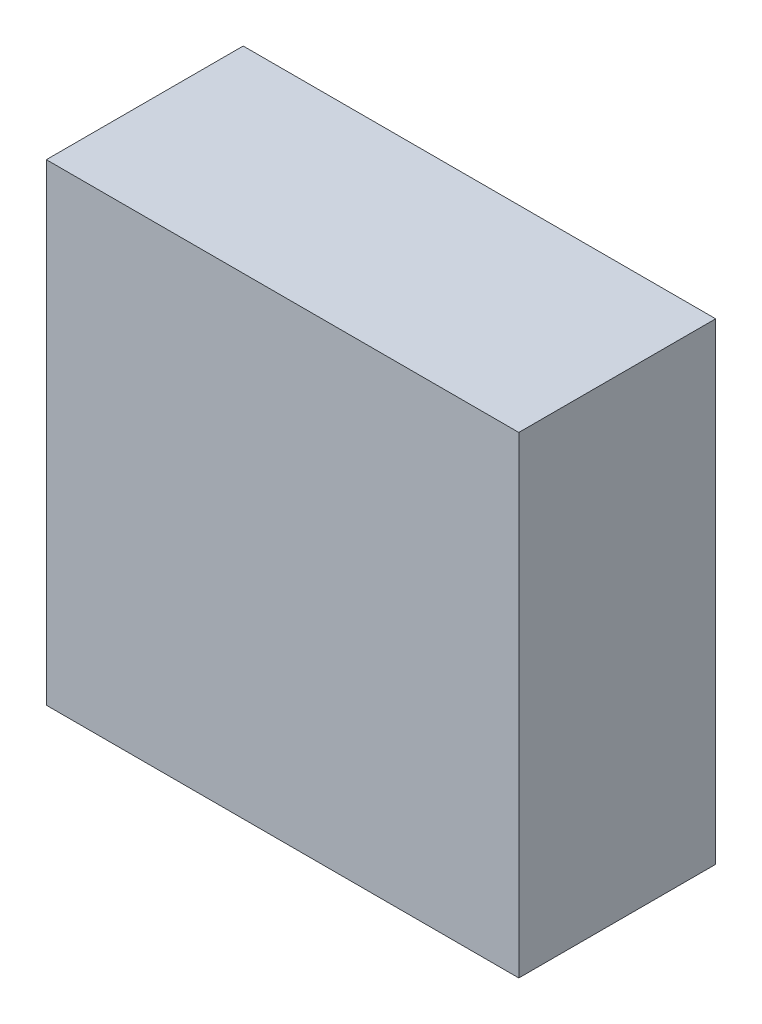
ISO-10303-21;
HEADER;
FILE_DESCRIPTION(('STEP AP214'),'2;1');
FILE_NAME('part.step','',(''),(''),'','','');
FILE_SCHEMA(('AUTOMOTIVE_DESIGN { 1 0 10303 214 1 1 1 1 }'));
ENDSEC;
DATA;
#1=APPLICATION_CONTEXT('core data for automotive mechanical design processes');
#2=APPLICATION_PROTOCOL_DEFINITION('international standard','automotive_design',2000,#1);
#3=PRODUCT_CONTEXT('',#1,'mechanical');
#4=PRODUCT('Part','Part','',(#3));
#5=PRODUCT_RELATED_PRODUCT_CATEGORY('part','',(#4));
#6=PRODUCT_DEFINITION_FORMATION('','',#4);
#7=PRODUCT_DEFINITION_CONTEXT('part definition',#1,'design');
#8=PRODUCT_DEFINITION('design','',#6,#7);
#9=PRODUCT_DEFINITION_SHAPE('','',#8);
#10=(LENGTH_UNIT() NAMED_UNIT(*) SI_UNIT(.MILLI.,.METRE.));
#11=(NAMED_UNIT(*) PLANE_ANGLE_UNIT() SI_UNIT($,.RADIAN.));
#12=(NAMED_UNIT(*) SI_UNIT($,.STERADIAN.) SOLID_ANGLE_UNIT());
#13=UNCERTAINTY_MEASURE_WITH_UNIT(LENGTH_MEASURE(1.E-05),#10,'distance_accuracy_value','');
#14=(GEOMETRIC_REPRESENTATION_CONTEXT(3) GLOBAL_UNCERTAINTY_ASSIGNED_CONTEXT((#13)) GLOBAL_UNIT_ASSIGNED_CONTEXT((#10,
#11,#12)) REPRESENTATION_CONTEXT('',''));
#15=CARTESIAN_POINT('',(0.,0.,0.));
#16=DIRECTION('',(0.,0.,1.));
#17=DIRECTION('',(1.,0.,0.));
#18=AXIS2_PLACEMENT_3D('',#15,#16,#17);
#19=CARTESIAN_POINT('',(-5.207,5.162,-8.00099999999999));
#20=DIRECTION('',(0.,0.,1.));
#21=DIRECTION('',(1.,0.,0.));
#22=AXIS2_PLACEMENT_3D('',#19,#20,#21);
#23=PLANE('',#22);
#24=DIRECTION('',(-1.,0.,0.));
#25=VECTOR('',#24,1.);
#26=CARTESIAN_POINT('',(-5.207,4.4,-8.00099999999999));
#27=LINE('',#26,#25);
#28=CARTESIAN_POINT('',(-4.445,4.4,-8.00099999999999));
#29=VERTEX_POINT('',#28);
#30=CARTESIAN_POINT('',(-5.207,4.4,-8.00099999999999));
#31=VERTEX_POINT('',#30);
#32=EDGE_CURVE('E11',#29,#31,#27,.T.);
#33=ORIENTED_EDGE('',*,*,#32,.T.);
#34=DIRECTION('',(0.,-1.,0.));
#35=VECTOR('',#34,1.);
#36=CARTESIAN_POINT('',(-5.207,5.162,-8.00099999999999));
#37=LINE('',#36,#35);
#38=CARTESIAN_POINT('',(-5.207,5.162,-8.00099999999999));
#39=VERTEX_POINT('',#38);
#40=EDGE_CURVE('E24',#39,#31,#37,.T.);
#41=ORIENTED_EDGE('',*,*,#40,.F.);
#42=DIRECTION('',(-1.,0.,0.));
#43=VECTOR('',#42,1.);
#44=CARTESIAN_POINT('',(-5.207,5.162,-8.00099999999999));
#45=LINE('',#44,#43);
#46=CARTESIAN_POINT('',(-4.445,5.162,-8.00099999999999));
#47=VERTEX_POINT('',#46);
#48=EDGE_CURVE('E88',#47,#39,#45,.T.);
#49=ORIENTED_EDGE('',*,*,#48,.F.);
#50=DIRECTION('',(0.,-1.,0.));
#51=VECTOR('',#50,1.);
#52=CARTESIAN_POINT('',(-4.445,5.162,-8.00099999999999));
#53=LINE('',#52,#51);
#54=EDGE_CURVE('E77',#47,#29,#53,.T.);
#55=ORIENTED_EDGE('',*,*,#54,.T.);
#56=EDGE_LOOP('',(#33,#41,#49,#55));
#57=FACE_BOUND('',#56,.T.);
#58=ADVANCED_FACE('F17',(#57),#23,.F.);
#59=CARTESIAN_POINT('',(-5.207,5.162,-8.00099999999999));
#60=DIRECTION('',(1.,0.,0.));
#61=DIRECTION('',(0.,0.,-1.));
#62=AXIS2_PLACEMENT_3D('',#59,#60,#61);
#63=PLANE('',#62);
#64=DIRECTION('',(0.,0.,1.));
#65=VECTOR('',#64,1.);
#66=CARTESIAN_POINT('',(-5.207,4.4,-8.00099999999999));
#67=LINE('',#66,#65);
#68=CARTESIAN_POINT('',(-5.207,4.4,-7.68349999999999));
#69=VERTEX_POINT('',#68);
#70=EDGE_CURVE('E85',#31,#69,#67,.T.);
#71=ORIENTED_EDGE('',*,*,#70,.T.);
#72=DIRECTION('',(0.,-1.,0.));
#73=VECTOR('',#72,1.);
#74=CARTESIAN_POINT('',(-5.207,5.162,-7.68349999999999));
#75=LINE('',#74,#73);
#76=CARTESIAN_POINT('',(-5.207,5.162,-7.68349999999999));
#77=VERTEX_POINT('',#76);
#78=EDGE_CURVE('E83',#77,#69,#75,.T.);
#79=ORIENTED_EDGE('',*,*,#78,.F.);
#80=DIRECTION('',(0.,0.,1.));
#81=VECTOR('',#80,1.);
#82=CARTESIAN_POINT('',(-5.207,5.162,-8.00099999999999));
#83=LINE('',#82,#81);
#84=EDGE_CURVE('E72',#39,#77,#83,.T.);
#85=ORIENTED_EDGE('',*,*,#84,.F.);
#86=ORIENTED_EDGE('',*,*,#40,.T.);
#87=EDGE_LOOP('',(#71,#79,#85,#86));
#88=FACE_BOUND('',#87,.T.);
#89=ADVANCED_FACE('F90',(#88),#63,.F.);
#90=CARTESIAN_POINT('',(-5.207,5.162,-7.68349999999999));
#91=DIRECTION('',(0.,0.,-1.));
#92=DIRECTION('',(-1.,0.,0.));
#93=AXIS2_PLACEMENT_3D('',#90,#91,#92);
#94=PLANE('',#93);
#95=DIRECTION('',(1.,0.,0.));
#96=VECTOR('',#95,1.);
#97=CARTESIAN_POINT('',(-5.207,4.4,-7.68349999999999));
#98=LINE('',#97,#96);
#99=CARTESIAN_POINT('',(-4.445,4.4,-7.68349999999999));
#100=VERTEX_POINT('',#99);
#101=EDGE_CURVE('E60',#69,#100,#98,.T.);
#102=ORIENTED_EDGE('',*,*,#101,.T.);
#103=DIRECTION('',(0.,-1.,0.));
#104=VECTOR('',#103,1.);
#105=CARTESIAN_POINT('',(-4.445,5.162,-7.68349999999999));
#106=LINE('',#105,#104);
#107=CARTESIAN_POINT('',(-4.445,5.162,-7.68349999999999));
#108=VERTEX_POINT('',#107);
#109=EDGE_CURVE('E54',#108,#100,#106,.T.);
#110=ORIENTED_EDGE('',*,*,#109,.F.);
#111=DIRECTION('',(1.,0.,0.));
#112=VECTOR('',#111,1.);
#113=CARTESIAN_POINT('',(-5.207,5.162,-7.68349999999999));
#114=LINE('',#113,#112);
#115=EDGE_CURVE('E58',#77,#108,#114,.T.);
#116=ORIENTED_EDGE('',*,*,#115,.F.);
#117=ORIENTED_EDGE('',*,*,#78,.T.);
#118=EDGE_LOOP('',(#102,#110,#116,#117));
#119=FACE_BOUND('',#118,.T.);
#120=ADVANCED_FACE('F56',(#119),#94,.F.);
#121=CARTESIAN_POINT('',(-4.445,5.162,-8.00099999999999));
#122=DIRECTION('',(-1.,0.,0.));
#123=DIRECTION('',(0.,0.,1.));
#124=AXIS2_PLACEMENT_3D('',#121,#122,#123);
#125=PLANE('',#124);
#126=DIRECTION('',(0.,0.,-1.));
#127=VECTOR('',#126,1.);
#128=CARTESIAN_POINT('',(-4.445,4.4,-8.00099999999999));
#129=LINE('',#128,#127);
#130=EDGE_CURVE('E73',#100,#29,#129,.T.);
#131=ORIENTED_EDGE('',*,*,#130,.T.);
#132=ORIENTED_EDGE('',*,*,#54,.F.);
#133=DIRECTION('',(0.,0.,-1.));
#134=VECTOR('',#133,1.);
#135=CARTESIAN_POINT('',(-4.445,5.162,-8.00099999999999));
#136=LINE('',#135,#134);
#137=EDGE_CURVE('E70',#108,#47,#136,.T.);
#138=ORIENTED_EDGE('',*,*,#137,.F.);
#139=ORIENTED_EDGE('',*,*,#109,.T.);
#140=EDGE_LOOP('',(#131,#132,#138,#139));
#141=FACE_BOUND('',#140,.T.);
#142=ADVANCED_FACE('F76',(#141),#125,.F.);
#143=CARTESIAN_POINT('',(0.,5.162,0.));
#144=DIRECTION('',(0.,-1.,0.));
#145=DIRECTION('',(0.,0.,-1.));
#146=AXIS2_PLACEMENT_3D('',#143,#144,#145);
#147=PLANE('',#146);
#148=ORIENTED_EDGE('',*,*,#48,.T.);
#149=ORIENTED_EDGE('',*,*,#84,.T.);
#150=ORIENTED_EDGE('',*,*,#115,.T.);
#151=ORIENTED_EDGE('',*,*,#137,.T.);
#152=EDGE_LOOP('',(#148,#149,#150,#151));
#153=FACE_BOUND('',#152,.T.);
#154=ADVANCED_FACE('F69',(#153),#147,.F.);
#155=CARTESIAN_POINT('',(0.,4.4,0.));
#156=DIRECTION('',(0.,-1.,0.));
#157=DIRECTION('',(0.,0.,-1.));
#158=AXIS2_PLACEMENT_3D('',#155,#156,#157);
#159=PLANE('',#158);
#160=ORIENTED_EDGE('',*,*,#32,.F.);
#161=ORIENTED_EDGE('',*,*,#130,.F.);
#162=ORIENTED_EDGE('',*,*,#101,.F.);
#163=ORIENTED_EDGE('',*,*,#70,.F.);
#164=EDGE_LOOP('',(#160,#161,#162,#163));
#165=FACE_BOUND('',#164,.T.);
#166=ADVANCED_FACE('F91',(#165),#159,.T.);
#167=CLOSED_SHELL('',(#58,#89,#120,#142,#154,#166));
#168=MANIFOLD_SOLID_BREP('B1',#167);
#169=ADVANCED_BREP_SHAPE_REPRESENTATION('',(#18,#168),#14);
#170=SHAPE_DEFINITION_REPRESENTATION(#9,#169);
ENDSEC;
END-ISO-10303-21;
